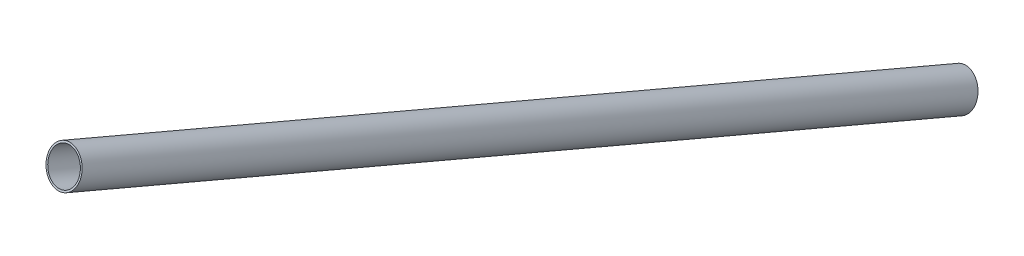
ISO-10303-21;
HEADER;
FILE_DESCRIPTION(('STEP AP214'),'2;1');
FILE_NAME('part.step','',(''),(''),'','','');
FILE_SCHEMA(('AUTOMOTIVE_DESIGN { 1 0 10303 214 1 1 1 1 }'));
ENDSEC;
DATA;
#1=APPLICATION_CONTEXT('core data for automotive mechanical design processes');
#2=APPLICATION_PROTOCOL_DEFINITION('international standard','automotive_design',2000,#1);
#3=PRODUCT_CONTEXT('',#1,'mechanical');
#4=PRODUCT('Part','Part','',(#3));
#5=PRODUCT_RELATED_PRODUCT_CATEGORY('part','',(#4));
#6=PRODUCT_DEFINITION_FORMATION('','',#4);
#7=PRODUCT_DEFINITION_CONTEXT('part definition',#1,'design');
#8=PRODUCT_DEFINITION('design','',#6,#7);
#9=PRODUCT_DEFINITION_SHAPE('','',#8);
#10=(LENGTH_UNIT() NAMED_UNIT(*) SI_UNIT(.MILLI.,.METRE.));
#11=(NAMED_UNIT(*) PLANE_ANGLE_UNIT() SI_UNIT($,.RADIAN.));
#12=(NAMED_UNIT(*) SI_UNIT($,.STERADIAN.) SOLID_ANGLE_UNIT());
#13=UNCERTAINTY_MEASURE_WITH_UNIT(LENGTH_MEASURE(1.E-05),#10,'distance_accuracy_value','');
#14=(GEOMETRIC_REPRESENTATION_CONTEXT(3) GLOBAL_UNCERTAINTY_ASSIGNED_CONTEXT((#13)) GLOBAL_UNIT_ASSIGNED_CONTEXT((#10,
#11,#12)) REPRESENTATION_CONTEXT('',''));
#15=CARTESIAN_POINT('',(0.,0.,0.));
#16=DIRECTION('',(0.,0.,1.));
#17=DIRECTION('',(1.,0.,0.));
#18=AXIS2_PLACEMENT_3D('',#15,#16,#17);
#19=CARTESIAN_POINT('',(-169.428571428571,0.,-995.));
#20=DIRECTION('',(-0.0952883546426031,0.34294009382942,0.934511755685168));
#21=DIRECTION('',(0.,-0.938783490773443,0.344507703036126));
#22=AXIS2_PLACEMENT_3D('',#19,#20,#21);
#23=CYLINDRICAL_SURFACE('',#22,11.3);
#24=CARTESIAN_POINT('',(-169.428571428571,0.,-995.));
#25=DIRECTION('',(0.0952883546426032,-0.34294009382942,-0.934511755685168));
#26=DIRECTION('',(0.667120264212542,-0.674772457211416,0.315646454226648));
#27=AXIS2_PLACEMENT_3D('',#24,#25,#26);
#28=CIRCLE('',#27,11.3);
#29=CARTESIAN_POINT('',(-161.890112442969,-7.62492876648903,-991.433195067239));
#30=VERTEX_POINT('',#29);
#31=EDGE_CURVE('E46',#30,#30,#28,.T.);
#32=ORIENTED_EDGE('',*,*,#31,.T.);
#33=EDGE_LOOP('',(#32));
#34=FACE_BOUND('',#33,.T.);
#35=CARTESIAN_POINT('',(-225.,200.,-450.000000000001));
#36=DIRECTION('',(0.0952883546426032,-0.34294009382942,-0.934511755685168));
#37=DIRECTION('',(0.667120264212542,-0.674772457211416,0.315646454226648));
#38=AXIS2_PLACEMENT_3D('',#35,#36,#37);
#39=CIRCLE('',#38,11.3);
#40=CARTESIAN_POINT('',(-217.461541014398,192.375071233511,-446.43319506724));
#41=VERTEX_POINT('',#40);
#42=EDGE_CURVE('E52',#41,#41,#39,.T.);
#43=ORIENTED_EDGE('',*,*,#42,.F.);
#44=EDGE_LOOP('',(#43));
#45=FACE_BOUND('',#44,.T.);
#46=ADVANCED_FACE('F39',(#34,#45),#23,.F.);
#47=CARTESIAN_POINT('',(-169.428571428571,0.,-995.));
#48=DIRECTION('',(-0.0952883546426031,0.34294009382942,0.934511755685168));
#49=DIRECTION('',(0.,-0.938783490773443,0.344507703036126));
#50=AXIS2_PLACEMENT_3D('',#47,#48,#49);
#51=CYLINDRICAL_SURFACE('',#50,12.5);
#52=CARTESIAN_POINT('',(-169.428571428571,0.,-995.));
#53=DIRECTION('',(0.0952883546426032,-0.34294009382942,-0.934511755685168));
#54=DIRECTION('',(0.667120264212542,-0.674772457211416,0.315646454226648));
#55=AXIS2_PLACEMENT_3D('',#52,#53,#54);
#56=CIRCLE('',#55,12.5);
#57=CARTESIAN_POINT('',(-161.089568125914,-8.43465571514274,-991.054419322167));
#58=VERTEX_POINT('',#57);
#59=EDGE_CURVE('E10',#58,#58,#56,.T.);
#60=ORIENTED_EDGE('',*,*,#59,.F.);
#61=EDGE_LOOP('',(#60));
#62=FACE_BOUND('',#61,.T.);
#63=CARTESIAN_POINT('',(-225.,200.,-450.000000000001));
#64=DIRECTION('',(0.0952883546426032,-0.34294009382942,-0.934511755685168));
#65=DIRECTION('',(0.667120264212542,-0.674772457211416,0.315646454226648));
#66=AXIS2_PLACEMENT_3D('',#63,#64,#65);
#67=CIRCLE('',#66,12.5);
#68=CARTESIAN_POINT('',(-216.660996697343,191.565344284857,-446.054419322168));
#69=VERTEX_POINT('',#68);
#70=EDGE_CURVE('E42',#69,#69,#67,.T.);
#71=ORIENTED_EDGE('',*,*,#70,.T.);
#72=EDGE_LOOP('',(#71));
#73=FACE_BOUND('',#72,.T.);
#74=ADVANCED_FACE('F59',(#62,#73),#51,.T.);
#75=CARTESIAN_POINT('',(-169.428571428571,0.,-995.));
#76=DIRECTION('',(0.0952883546426032,-0.34294009382942,-0.934511755685168));
#77=DIRECTION('',(0.667120264212542,-0.674772457211416,0.315646454226648));
#78=AXIS2_PLACEMENT_3D('',#75,#76,#77);
#79=PLANE('',#78);
#80=ORIENTED_EDGE('',*,*,#31,.F.);
#81=EDGE_LOOP('',(#80));
#82=FACE_BOUND('',#81,.T.);
#83=ORIENTED_EDGE('',*,*,#59,.T.);
#84=EDGE_LOOP('',(#83));
#85=FACE_BOUND('',#84,.T.);
#86=ADVANCED_FACE('F63',(#82,#85),#79,.T.);
#87=CARTESIAN_POINT('',(-225.,200.,-450.000000000001));
#88=DIRECTION('',(0.0952883546426032,-0.34294009382942,-0.934511755685168));
#89=DIRECTION('',(0.667120264212542,-0.674772457211416,0.315646454226648));
#90=AXIS2_PLACEMENT_3D('',#87,#88,#89);
#91=PLANE('',#90);
#92=ORIENTED_EDGE('',*,*,#42,.T.);
#93=EDGE_LOOP('',(#92));
#94=FACE_BOUND('',#93,.T.);
#95=ORIENTED_EDGE('',*,*,#70,.F.);
#96=EDGE_LOOP('',(#95));
#97=FACE_BOUND('',#96,.T.);
#98=ADVANCED_FACE('F61',(#94,#97),#91,.F.);
#99=CLOSED_SHELL('',(#46,#74,#86,#98));
#100=MANIFOLD_SOLID_BREP('B2',#99);
#101=ADVANCED_BREP_SHAPE_REPRESENTATION('',(#18,#100),#14);
#102=SHAPE_DEFINITION_REPRESENTATION(#9,#101);
ENDSEC;
END-ISO-10303-21;
